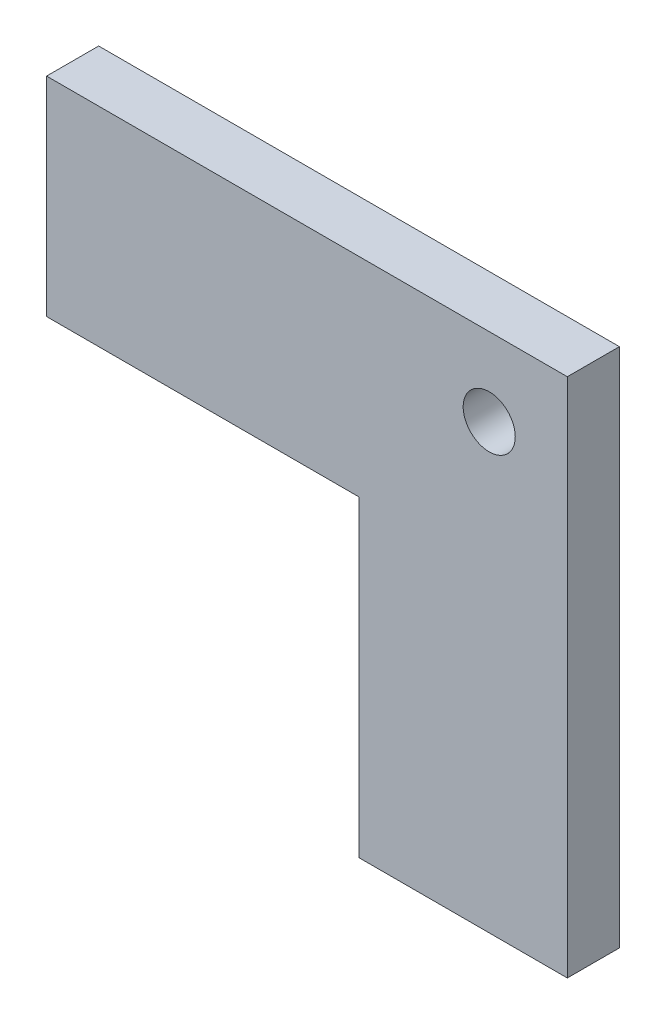
ISO-10303-21;
HEADER;
FILE_DESCRIPTION(('STEP AP214'),'2;1');
FILE_NAME('part.step','',(''),(''),'','','');
FILE_SCHEMA(('AUTOMOTIVE_DESIGN { 1 0 10303 214 1 1 1 1 }'));
ENDSEC;
DATA;
#1=APPLICATION_CONTEXT('core data for automotive mechanical design processes');
#2=APPLICATION_PROTOCOL_DEFINITION('international standard','automotive_design',2000,#1);
#3=PRODUCT_CONTEXT('',#1,'mechanical');
#4=PRODUCT('Part','Part','',(#3));
#5=PRODUCT_RELATED_PRODUCT_CATEGORY('part','',(#4));
#6=PRODUCT_DEFINITION_FORMATION('','',#4);
#7=PRODUCT_DEFINITION_CONTEXT('part definition',#1,'design');
#8=PRODUCT_DEFINITION('design','',#6,#7);
#9=PRODUCT_DEFINITION_SHAPE('','',#8);
#10=(LENGTH_UNIT() NAMED_UNIT(*) SI_UNIT(.MILLI.,.METRE.));
#11=(NAMED_UNIT(*) PLANE_ANGLE_UNIT() SI_UNIT($,.RADIAN.));
#12=(NAMED_UNIT(*) SI_UNIT($,.STERADIAN.) SOLID_ANGLE_UNIT());
#13=UNCERTAINTY_MEASURE_WITH_UNIT(LENGTH_MEASURE(1.E-05),#10,'distance_accuracy_value','');
#14=(GEOMETRIC_REPRESENTATION_CONTEXT(3) GLOBAL_UNCERTAINTY_ASSIGNED_CONTEXT((#13)) GLOBAL_UNIT_ASSIGNED_CONTEXT((#10,
#11,#12)) REPRESENTATION_CONTEXT('',''));
#15=CARTESIAN_POINT('',(0.,0.,0.));
#16=DIRECTION('',(0.,0.,1.));
#17=DIRECTION('',(1.,0.,0.));
#18=AXIS2_PLACEMENT_3D('',#15,#16,#17);
#19=CARTESIAN_POINT('',(-35.1033707865169,99.5308988764045,-12.7));
#20=DIRECTION('',(-1.,0.,0.));
#21=DIRECTION('',(0.,-1.,0.));
#22=AXIS2_PLACEMENT_3D('',#19,#20,#21);
#23=PLANE('',#22);
#24=DIRECTION('',(0.,0.,1.));
#25=VECTOR('',#24,1.);
#26=CARTESIAN_POINT('',(-35.1033707865168,48.7308988764045,-12.7));
#27=LINE('',#26,#25);
#28=CARTESIAN_POINT('',(-35.1033707865168,48.7308988764045,-12.7));
#29=VERTEX_POINT('',#28);
#30=CARTESIAN_POINT('',(-35.1033707865168,48.7308988764045,0.));
#31=VERTEX_POINT('',#30);
#32=EDGE_CURVE('E140',#29,#31,#27,.T.);
#33=ORIENTED_EDGE('',*,*,#32,.T.);
#34=DIRECTION('',(0.,-1.,0.));
#35=VECTOR('',#34,1.);
#36=CARTESIAN_POINT('',(-35.1033707865169,99.5308988764045,0.));
#37=LINE('',#36,#35);
#38=CARTESIAN_POINT('',(-35.1033707865169,99.5308988764045,0.));
#39=VERTEX_POINT('',#38);
#40=EDGE_CURVE('E136',#39,#31,#37,.T.);
#41=ORIENTED_EDGE('',*,*,#40,.F.);
#42=DIRECTION('',(0.,0.,1.));
#43=VECTOR('',#42,1.);
#44=CARTESIAN_POINT('',(-35.1033707865169,99.5308988764045,-12.7));
#45=LINE('',#44,#43);
#46=CARTESIAN_POINT('',(-35.1033707865169,99.5308988764045,-12.7));
#47=VERTEX_POINT('',#46);
#48=EDGE_CURVE('E11',#47,#39,#45,.T.);
#49=ORIENTED_EDGE('',*,*,#48,.F.);
#50=DIRECTION('',(0.,-1.,0.));
#51=VECTOR('',#50,1.);
#52=CARTESIAN_POINT('',(-35.1033707865169,99.5308988764045,-12.7));
#53=LINE('',#52,#51);
#54=EDGE_CURVE('E125',#47,#29,#53,.T.);
#55=ORIENTED_EDGE('',*,*,#54,.T.);
#56=EDGE_LOOP('',(#33,#41,#49,#55));
#57=FACE_BOUND('',#56,.T.);
#58=ADVANCED_FACE('F43',(#57),#23,.T.);
#59=CARTESIAN_POINT('',(-35.1033707865169,99.5308988764045,-12.7));
#60=DIRECTION('',(0.,1.,0.));
#61=DIRECTION('',(0.,0.,1.));
#62=AXIS2_PLACEMENT_3D('',#59,#60,#61);
#63=PLANE('',#62);
#64=DIRECTION('',(-1.,0.,0.));
#65=VECTOR('',#64,1.);
#66=CARTESIAN_POINT('',(-35.1033707865169,99.5308988764045,0.));
#67=LINE('',#66,#65);
#68=CARTESIAN_POINT('',(91.8966292134831,99.5308988764045,0.));
#69=VERTEX_POINT('',#68);
#70=EDGE_CURVE('E131',#69,#39,#67,.T.);
#71=ORIENTED_EDGE('',*,*,#70,.F.);
#72=DIRECTION('',(0.,0.,1.));
#73=VECTOR('',#72,1.);
#74=CARTESIAN_POINT('',(91.8966292134831,99.5308988764045,-12.7));
#75=LINE('',#74,#73);
#76=CARTESIAN_POINT('',(91.8966292134831,99.5308988764045,-12.7));
#77=VERTEX_POINT('',#76);
#78=EDGE_CURVE('E52',#77,#69,#75,.T.);
#79=ORIENTED_EDGE('',*,*,#78,.F.);
#80=DIRECTION('',(-1.,0.,0.));
#81=VECTOR('',#80,1.);
#82=CARTESIAN_POINT('',(-35.1033707865169,99.5308988764045,-12.7));
#83=LINE('',#82,#81);
#84=EDGE_CURVE('E129',#77,#47,#83,.T.);
#85=ORIENTED_EDGE('',*,*,#84,.T.);
#86=ORIENTED_EDGE('',*,*,#48,.T.);
#87=EDGE_LOOP('',(#71,#79,#85,#86));
#88=FACE_BOUND('',#87,.T.);
#89=ADVANCED_FACE('F157',(#88),#63,.T.);
#90=CARTESIAN_POINT('',(91.8966292134831,99.5308988764045,-12.7));
#91=DIRECTION('',(1.,0.,0.));
#92=DIRECTION('',(0.,1.,0.));
#93=AXIS2_PLACEMENT_3D('',#90,#91,#92);
#94=PLANE('',#93);
#95=DIRECTION('',(0.,1.,0.));
#96=VECTOR('',#95,1.);
#97=CARTESIAN_POINT('',(91.8966292134831,99.5308988764045,0.));
#98=LINE('',#97,#96);
#99=CARTESIAN_POINT('',(91.8966292134832,-27.4691011235955,0.));
#100=VERTEX_POINT('',#99);
#101=EDGE_CURVE('E143',#100,#69,#98,.T.);
#102=ORIENTED_EDGE('',*,*,#101,.F.);
#103=DIRECTION('',(0.,0.,1.));
#104=VECTOR('',#103,1.);
#105=CARTESIAN_POINT('',(91.8966292134832,-27.4691011235955,-12.7));
#106=LINE('',#105,#104);
#107=CARTESIAN_POINT('',(91.8966292134832,-27.4691011235955,-12.7));
#108=VERTEX_POINT('',#107);
#109=EDGE_CURVE('E46',#108,#100,#106,.T.);
#110=ORIENTED_EDGE('',*,*,#109,.F.);
#111=DIRECTION('',(0.,1.,0.));
#112=VECTOR('',#111,1.);
#113=CARTESIAN_POINT('',(91.8966292134831,99.5308988764045,-12.7));
#114=LINE('',#113,#112);
#115=EDGE_CURVE('E123',#108,#77,#114,.T.);
#116=ORIENTED_EDGE('',*,*,#115,.T.);
#117=ORIENTED_EDGE('',*,*,#78,.T.);
#118=EDGE_LOOP('',(#102,#110,#116,#117));
#119=FACE_BOUND('',#118,.T.);
#120=ADVANCED_FACE('F153',(#119),#94,.T.);
#121=CARTESIAN_POINT('',(-35.1033707865168,-27.4691011235955,-12.7));
#122=DIRECTION('',(0.,-1.,0.));
#123=DIRECTION('',(0.,0.,-1.));
#124=AXIS2_PLACEMENT_3D('',#121,#122,#123);
#125=PLANE('',#124);
#126=DIRECTION('',(0.,0.,1.));
#127=VECTOR('',#126,1.);
#128=CARTESIAN_POINT('',(41.0966292134831,-27.4691011235955,-12.7));
#129=LINE('',#128,#127);
#130=CARTESIAN_POINT('',(41.0966292134831,-27.4691011235955,-12.7));
#131=VERTEX_POINT('',#130);
#132=CARTESIAN_POINT('',(41.0966292134831,-27.4691011235955,0.));
#133=VERTEX_POINT('',#132);
#134=EDGE_CURVE('E60',#131,#133,#129,.T.);
#135=ORIENTED_EDGE('',*,*,#134,.F.);
#136=DIRECTION('',(1.,0.,0.));
#137=VECTOR('',#136,1.);
#138=CARTESIAN_POINT('',(-35.1033707865168,-27.4691011235955,-12.7));
#139=LINE('',#138,#137);
#140=EDGE_CURVE('E88',#131,#108,#139,.T.);
#141=ORIENTED_EDGE('',*,*,#140,.T.);
#142=ORIENTED_EDGE('',*,*,#109,.T.);
#143=DIRECTION('',(1.,0.,0.));
#144=VECTOR('',#143,1.);
#145=CARTESIAN_POINT('',(-35.1033707865168,-27.4691011235955,0.));
#146=LINE('',#145,#144);
#147=EDGE_CURVE('E116',#133,#100,#146,.T.);
#148=ORIENTED_EDGE('',*,*,#147,.F.);
#149=EDGE_LOOP('',(#135,#141,#142,#148));
#150=FACE_BOUND('',#149,.T.);
#151=ADVANCED_FACE('F115',(#150),#125,.T.);
#152=CARTESIAN_POINT('',(0.,0.,-12.7));
#153=DIRECTION('',(0.,0.,1.));
#154=DIRECTION('',(1.,0.,0.));
#155=AXIS2_PLACEMENT_3D('',#152,#153,#154);
#156=PLANE('',#155);
#157=CARTESIAN_POINT('',(72.8466292134832,80.4808988764045,-12.7));
#158=DIRECTION('',(0.,0.,1.));
#159=DIRECTION('',(1.,0.,0.));
#160=AXIS2_PLACEMENT_3D('',#157,#158,#159);
#161=CIRCLE('',#160,6.34999999999999);
#162=CARTESIAN_POINT('',(79.1966292134831,80.4808988764045,-12.7));
#163=VERTEX_POINT('',#162);
#164=EDGE_CURVE('E166',#163,#163,#161,.T.);
#165=ORIENTED_EDGE('',*,*,#164,.T.);
#166=EDGE_LOOP('',(#165));
#167=FACE_BOUND('',#166,.T.);
#168=DIRECTION('',(0.,1.,0.));
#169=VECTOR('',#168,1.);
#170=CARTESIAN_POINT('',(41.0966292134831,-27.4691011235955,-12.7));
#171=LINE('',#170,#169);
#172=CARTESIAN_POINT('',(41.0966292134831,48.7308988764045,-12.7));
#173=VERTEX_POINT('',#172);
#174=EDGE_CURVE('E104',#131,#173,#171,.T.);
#175=ORIENTED_EDGE('',*,*,#174,.T.);
#176=DIRECTION('',(-1.,0.,0.));
#177=VECTOR('',#176,1.);
#178=CARTESIAN_POINT('',(-35.1033707865168,48.7308988764045,-12.7));
#179=LINE('',#178,#177);
#180=EDGE_CURVE('E111',#173,#29,#179,.T.);
#181=ORIENTED_EDGE('',*,*,#180,.T.);
#182=ORIENTED_EDGE('',*,*,#54,.F.);
#183=ORIENTED_EDGE('',*,*,#84,.F.);
#184=ORIENTED_EDGE('',*,*,#115,.F.);
#185=ORIENTED_EDGE('',*,*,#140,.F.);
#186=EDGE_LOOP('',(#175,#181,#182,#183,#184,#185));
#187=FACE_BOUND('',#186,.T.);
#188=ADVANCED_FACE('F120',(#167,#187),#156,.F.);
#189=CARTESIAN_POINT('',(0.,0.,0.));
#190=DIRECTION('',(0.,0.,1.));
#191=DIRECTION('',(1.,0.,0.));
#192=AXIS2_PLACEMENT_3D('',#189,#190,#191);
#193=PLANE('',#192);
#194=CARTESIAN_POINT('',(72.8466292134832,80.4808988764045,0.));
#195=DIRECTION('',(0.,0.,1.));
#196=DIRECTION('',(1.,0.,0.));
#197=AXIS2_PLACEMENT_3D('',#194,#195,#196);
#198=CIRCLE('',#197,6.34999999999999);
#199=CARTESIAN_POINT('',(79.1966292134831,80.4808988764045,0.));
#200=VERTEX_POINT('',#199);
#201=EDGE_CURVE('E174',#200,#200,#198,.T.);
#202=ORIENTED_EDGE('',*,*,#201,.F.);
#203=EDGE_LOOP('',(#202));
#204=FACE_BOUND('',#203,.T.);
#205=DIRECTION('',(-1.,0.,0.));
#206=VECTOR('',#205,1.);
#207=CARTESIAN_POINT('',(-35.1033707865168,48.7308988764045,0.));
#208=LINE('',#207,#206);
#209=CARTESIAN_POINT('',(41.0966292134831,48.7308988764045,0.));
#210=VERTEX_POINT('',#209);
#211=EDGE_CURVE('E112',#210,#31,#208,.T.);
#212=ORIENTED_EDGE('',*,*,#211,.F.);
#213=DIRECTION('',(0.,1.,0.));
#214=VECTOR('',#213,1.);
#215=CARTESIAN_POINT('',(41.0966292134831,-27.4691011235955,0.));
#216=LINE('',#215,#214);
#217=EDGE_CURVE('E162',#133,#210,#216,.T.);
#218=ORIENTED_EDGE('',*,*,#217,.F.);
#219=ORIENTED_EDGE('',*,*,#147,.T.);
#220=ORIENTED_EDGE('',*,*,#101,.T.);
#221=ORIENTED_EDGE('',*,*,#70,.T.);
#222=ORIENTED_EDGE('',*,*,#40,.T.);
#223=EDGE_LOOP('',(#212,#218,#219,#220,#221,#222));
#224=FACE_BOUND('',#223,.T.);
#225=ADVANCED_FACE('F156',(#204,#224),#193,.T.);
#226=CARTESIAN_POINT('',(-35.1033707865168,48.7308988764045,-12.7));
#227=DIRECTION('',(0.,1.,0.));
#228=DIRECTION('',(0.,0.,1.));
#229=AXIS2_PLACEMENT_3D('',#226,#227,#228);
#230=PLANE('',#229);
#231=ORIENTED_EDGE('',*,*,#211,.T.);
#232=ORIENTED_EDGE('',*,*,#32,.F.);
#233=ORIENTED_EDGE('',*,*,#180,.F.);
#234=DIRECTION('',(0.,0.,1.));
#235=VECTOR('',#234,1.);
#236=CARTESIAN_POINT('',(41.0966292134831,48.7308988764045,-12.7));
#237=LINE('',#236,#235);
#238=EDGE_CURVE('E106',#173,#210,#237,.T.);
#239=ORIENTED_EDGE('',*,*,#238,.T.);
#240=EDGE_LOOP('',(#231,#232,#233,#239));
#241=FACE_BOUND('',#240,.T.);
#242=ADVANCED_FACE('F171',(#241),#230,.F.);
#243=CARTESIAN_POINT('',(41.0966292134831,-27.4691011235955,-12.7));
#244=DIRECTION('',(1.,0.,0.));
#245=DIRECTION('',(0.,1.,0.));
#246=AXIS2_PLACEMENT_3D('',#243,#244,#245);
#247=PLANE('',#246);
#248=ORIENTED_EDGE('',*,*,#217,.T.);
#249=ORIENTED_EDGE('',*,*,#238,.F.);
#250=ORIENTED_EDGE('',*,*,#174,.F.);
#251=ORIENTED_EDGE('',*,*,#134,.T.);
#252=EDGE_LOOP('',(#248,#249,#250,#251));
#253=FACE_BOUND('',#252,.T.);
#254=ADVANCED_FACE('F105',(#253),#247,.F.);
#255=CARTESIAN_POINT('',(72.8466292134832,80.4808988764045,-12.7));
#256=DIRECTION('',(0.,0.,1.));
#257=DIRECTION('',(1.,0.,0.));
#258=AXIS2_PLACEMENT_3D('',#255,#256,#257);
#259=CYLINDRICAL_SURFACE('',#258,6.34999999999999);
#260=ORIENTED_EDGE('',*,*,#164,.F.);
#261=EDGE_LOOP('',(#260));
#262=FACE_BOUND('',#261,.T.);
#263=ORIENTED_EDGE('',*,*,#201,.T.);
#264=EDGE_LOOP('',(#263));
#265=FACE_BOUND('',#264,.T.);
#266=ADVANCED_FACE('F183',(#262,#265),#259,.F.);
#267=CLOSED_SHELL('',(#58,#89,#120,#151,#188,#225,#242,#254,#266));
#268=MANIFOLD_SOLID_BREP('B2',#267);
#269=ADVANCED_BREP_SHAPE_REPRESENTATION('',(#18,#268),#14);
#270=SHAPE_DEFINITION_REPRESENTATION(#9,#269);
ENDSEC;
END-ISO-10303-21;
